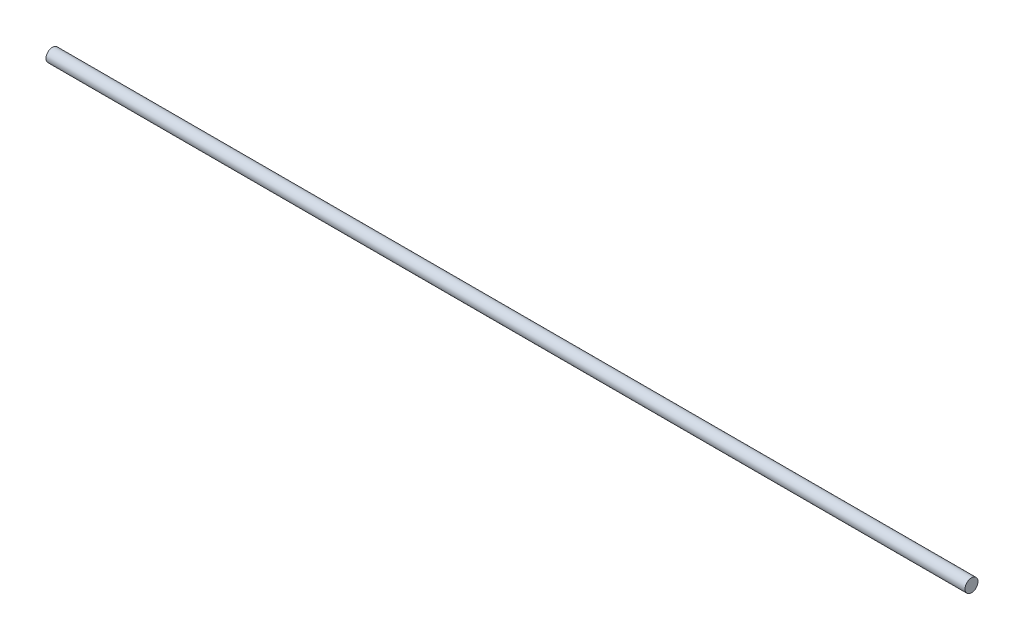
ISO-10303-21;
HEADER;
FILE_DESCRIPTION(('STEP AP214'),'2;1');
FILE_NAME('part.step','',(''),(''),'','','');
FILE_SCHEMA(('AUTOMOTIVE_DESIGN { 1 0 10303 214 1 1 1 1 }'));
ENDSEC;
DATA;
#1=APPLICATION_CONTEXT('core data for automotive mechanical design processes');
#2=APPLICATION_PROTOCOL_DEFINITION('international standard','automotive_design',2000,#1);
#3=PRODUCT_CONTEXT('',#1,'mechanical');
#4=PRODUCT('Part','Part','',(#3));
#5=PRODUCT_RELATED_PRODUCT_CATEGORY('part','',(#4));
#6=PRODUCT_DEFINITION_FORMATION('','',#4);
#7=PRODUCT_DEFINITION_CONTEXT('part definition',#1,'design');
#8=PRODUCT_DEFINITION('design','',#6,#7);
#9=PRODUCT_DEFINITION_SHAPE('','',#8);
#10=(LENGTH_UNIT() NAMED_UNIT(*) SI_UNIT(.MILLI.,.METRE.));
#11=(NAMED_UNIT(*) PLANE_ANGLE_UNIT() SI_UNIT($,.RADIAN.));
#12=(NAMED_UNIT(*) SI_UNIT($,.STERADIAN.) SOLID_ANGLE_UNIT());
#13=UNCERTAINTY_MEASURE_WITH_UNIT(LENGTH_MEASURE(1.E-05),#10,'distance_accuracy_value','');
#14=(GEOMETRIC_REPRESENTATION_CONTEXT(3) GLOBAL_UNCERTAINTY_ASSIGNED_CONTEXT((#13)) GLOBAL_UNIT_ASSIGNED_CONTEXT((#10,
#11,#12)) REPRESENTATION_CONTEXT('',''));
#15=CARTESIAN_POINT('',(0.,0.,0.));
#16=DIRECTION('',(0.,0.,1.));
#17=DIRECTION('',(1.,0.,0.));
#18=AXIS2_PLACEMENT_3D('',#15,#16,#17);
#19=CARTESIAN_POINT('',(898.392719523903,0.,0.));
#20=DIRECTION('',(-1.,0.,0.));
#21=DIRECTION('',(0.,0.,1.));
#22=AXIS2_PLACEMENT_3D('',#19,#20,#21);
#23=CYLINDRICAL_SURFACE('',#22,6.35);
#24=CARTESIAN_POINT('',(898.392719523903,0.,0.));
#25=DIRECTION('',(1.,0.,0.));
#26=DIRECTION('',(0.,0.,-1.));
#27=AXIS2_PLACEMENT_3D('',#24,#25,#26);
#28=CIRCLE('',#27,6.35);
#29=CARTESIAN_POINT('',(898.392719523903,0.,-6.35));
#30=VERTEX_POINT('',#29);
#31=EDGE_CURVE('E11',#30,#30,#28,.T.);
#32=ORIENTED_EDGE('',*,*,#31,.F.);
#33=EDGE_LOOP('',(#32));
#34=FACE_BOUND('',#33,.T.);
#35=CARTESIAN_POINT('',(0.,0.,0.));
#36=DIRECTION('',(1.,0.,0.));
#37=DIRECTION('',(0.,0.,-1.));
#38=AXIS2_PLACEMENT_3D('',#35,#36,#37);
#39=CIRCLE('',#38,6.35);
#40=CARTESIAN_POINT('',(0.,0.,-6.35));
#41=VERTEX_POINT('',#40);
#42=EDGE_CURVE('E51',#41,#41,#39,.T.);
#43=ORIENTED_EDGE('',*,*,#42,.T.);
#44=EDGE_LOOP('',(#43));
#45=FACE_BOUND('',#44,.T.);
#46=ADVANCED_FACE('F48',(#34,#45),#23,.T.);
#47=CARTESIAN_POINT('',(898.392719523903,0.,0.));
#48=DIRECTION('',(1.,0.,0.));
#49=DIRECTION('',(0.,0.,-1.));
#50=AXIS2_PLACEMENT_3D('',#47,#48,#49);
#51=PLANE('',#50);
#52=ORIENTED_EDGE('',*,*,#31,.T.);
#53=EDGE_LOOP('',(#52));
#54=FACE_BOUND('',#53,.T.);
#55=ADVANCED_FACE('F66',(#54),#51,.T.);
#56=CARTESIAN_POINT('',(0.,0.,0.));
#57=DIRECTION('',(1.,0.,0.));
#58=DIRECTION('',(0.,0.,-1.));
#59=AXIS2_PLACEMENT_3D('',#56,#57,#58);
#60=PLANE('',#59);
#61=ORIENTED_EDGE('',*,*,#42,.F.);
#62=EDGE_LOOP('',(#61));
#63=FACE_BOUND('',#62,.T.);
#64=ADVANCED_FACE('F64',(#63),#60,.F.);
#65=CLOSED_SHELL('',(#46,#55,#64));
#66=MANIFOLD_SOLID_BREP('B2',#65);
#67=ADVANCED_BREP_SHAPE_REPRESENTATION('',(#18,#66),#14);
#68=SHAPE_DEFINITION_REPRESENTATION(#9,#67);
ENDSEC;
END-ISO-10303-21;
